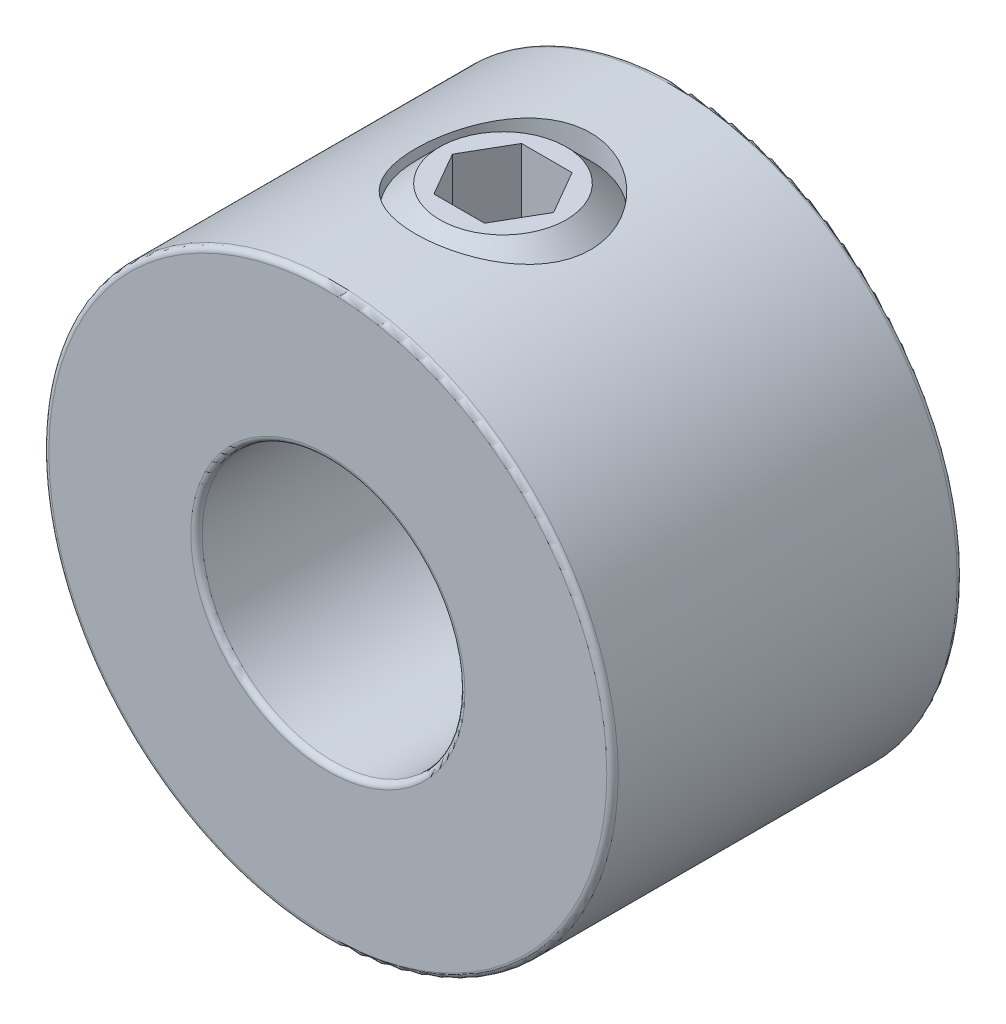
ISO-10303-21;
HEADER;
FILE_DESCRIPTION(('STEP AP214'),'2;1');
FILE_NAME('part.step','',(''),(''),'','','');
FILE_SCHEMA(('AUTOMOTIVE_DESIGN { 1 0 10303 214 1 1 1 1 }'));
ENDSEC;
DATA;
#1=APPLICATION_CONTEXT('core data for automotive mechanical design processes');
#2=APPLICATION_PROTOCOL_DEFINITION('international standard','automotive_design',2000,#1);
#3=PRODUCT_CONTEXT('',#1,'mechanical');
#4=PRODUCT('Part','Part','',(#3));
#5=PRODUCT_RELATED_PRODUCT_CATEGORY('part','',(#4));
#6=PRODUCT_DEFINITION_FORMATION('','',#4);
#7=PRODUCT_DEFINITION_CONTEXT('part definition',#1,'design');
#8=PRODUCT_DEFINITION('design','',#6,#7);
#9=PRODUCT_DEFINITION_SHAPE('','',#8);
#10=(LENGTH_UNIT() NAMED_UNIT(*) SI_UNIT(.MILLI.,.METRE.));
#11=(NAMED_UNIT(*) PLANE_ANGLE_UNIT() SI_UNIT($,.RADIAN.));
#12=(NAMED_UNIT(*) SI_UNIT($,.STERADIAN.) SOLID_ANGLE_UNIT());
#13=UNCERTAINTY_MEASURE_WITH_UNIT(LENGTH_MEASURE(1.E-05),#10,'distance_accuracy_value','');
#14=(GEOMETRIC_REPRESENTATION_CONTEXT(3) GLOBAL_UNCERTAINTY_ASSIGNED_CONTEXT((#13)) GLOBAL_UNIT_ASSIGNED_CONTEXT((#10,
#11,#12)) REPRESENTATION_CONTEXT('',''));
#15=CARTESIAN_POINT('',(0.,0.,0.));
#16=DIRECTION('',(0.,0.,1.));
#17=DIRECTION('',(1.,0.,0.));
#18=AXIS2_PLACEMENT_3D('',#15,#16,#17);
#19=CARTESIAN_POINT('',(0.,3.05662432702594,4.));
#20=DIRECTION('',(0.,1.,0.));
#21=DIRECTION('',(-1.,0.,0.));
#22=AXIS2_PLACEMENT_3D('',#19,#20,#21);
#23=CONICAL_SURFACE('',#22,2.,0.785398163397447);
#24=CARTESIAN_POINT('',(0.,2.5,4.));
#25=DIRECTION('',(0.,-1.,0.));
#26=DIRECTION('',(1.,0.,0.));
#27=AXIS2_PLACEMENT_3D('',#24,#25,#26);
#28=CIRCLE('',#27,1.44337567297405);
#29=CARTESIAN_POINT('',(1.44337567297405,2.5,4.));
#30=VERTEX_POINT('',#29);
#31=EDGE_CURVE('E12',#30,#30,#28,.T.);
#32=ORIENTED_EDGE('',*,*,#31,.F.);
#33=EDGE_LOOP('',(#32));
#34=FACE_BOUND('',#33,.T.);
#35=CARTESIAN_POINT('',(0.,3.05662432702594,4.));
#36=DIRECTION('',(0.,-1.,0.));
#37=DIRECTION('',(1.,0.,0.));
#38=AXIS2_PLACEMENT_3D('',#35,#36,#37);
#39=CIRCLE('',#38,2.);
#40=CARTESIAN_POINT('',(2.,3.05662432702594,4.));
#41=VERTEX_POINT('',#40);
#42=EDGE_CURVE('E140',#41,#41,#39,.T.);
#43=ORIENTED_EDGE('',*,*,#42,.T.);
#44=EDGE_LOOP('',(#43));
#45=FACE_BOUND('',#44,.T.);
#46=ADVANCED_FACE('F41',(#34,#45),#23,.T.);
#47=CARTESIAN_POINT('',(-0.5,2.5,4.));
#48=DIRECTION('',(0.,1.,0.));
#49=DIRECTION('',(-1.,0.,0.));
#50=AXIS2_PLACEMENT_3D('',#47,#48,#49);
#51=PLANE('',#50);
#52=CARTESIAN_POINT('',(0.,2.5,4.));
#53=DIRECTION('',(0.,-1.,0.));
#54=DIRECTION('',(1.,0.,0.));
#55=AXIS2_PLACEMENT_3D('',#52,#53,#54);
#56=CIRCLE('',#55,0.5);
#57=CARTESIAN_POINT('',(0.499999999999999,2.5,4.));
#58=VERTEX_POINT('',#57);
#59=EDGE_CURVE('E48',#58,#58,#56,.T.);
#60=ORIENTED_EDGE('',*,*,#59,.F.);
#61=EDGE_LOOP('',(#60));
#62=FACE_BOUND('',#61,.T.);
#63=ORIENTED_EDGE('',*,*,#31,.T.);
#64=EDGE_LOOP('',(#63));
#65=FACE_BOUND('',#64,.T.);
#66=ADVANCED_FACE('F160',(#62,#65),#51,.F.);
#67=CARTESIAN_POINT('',(0.,2.5,4.));
#68=DIRECTION('',(0.,-1.,0.));
#69=DIRECTION('',(1.,0.,0.));
#70=AXIS2_PLACEMENT_3D('',#67,#68,#69);
#71=CONICAL_SURFACE('',#70,0.5,0.523598775598296);
#72=CARTESIAN_POINT('',(0.,3.36602540378444,4.));
#73=VERTEX_POINT('',#72);
#74=VERTEX_LOOP('',#73);
#75=FACE_BOUND('',#74,.T.);
#76=ORIENTED_EDGE('',*,*,#59,.T.);
#77=EDGE_LOOP('',(#76));
#78=FACE_BOUND('',#77,.T.);
#79=ADVANCED_FACE('F158',(#75,#78),#71,.F.);
#80=CARTESIAN_POINT('',(0.,6.5,4.));
#81=DIRECTION('',(0.,-1.,0.));
#82=DIRECTION('',(1.,0.,0.));
#83=AXIS2_PLACEMENT_3D('',#80,#81,#82);
#84=PLANE('',#83);
#85=DIRECTION('',(0.5,0.,0.866025403784439));
#86=VECTOR('',#85,1.);
#87=CARTESIAN_POINT('',(-1.15470053837923,6.5,4.));
#88=LINE('',#87,#86);
#89=CARTESIAN_POINT('',(-1.15470053837923,6.5,4.));
#90=VERTEX_POINT('',#89);
#91=CARTESIAN_POINT('',(-0.577350269189609,6.5,5.));
#92=VERTEX_POINT('',#91);
#93=EDGE_CURVE('E128',#90,#92,#88,.T.);
#94=ORIENTED_EDGE('',*,*,#93,.F.);
#95=DIRECTION('',(-0.499999999999999,0.,0.866025403784439));
#96=VECTOR('',#95,1.);
#97=CARTESIAN_POINT('',(-0.57735026918961,6.5,3.));
#98=LINE('',#97,#96);
#99=CARTESIAN_POINT('',(-0.57735026918961,6.5,3.));
#100=VERTEX_POINT('',#99);
#101=EDGE_CURVE('E55',#100,#90,#98,.T.);
#102=ORIENTED_EDGE('',*,*,#101,.F.);
#103=DIRECTION('',(-1.,0.,0.));
#104=VECTOR('',#103,1.);
#105=CARTESIAN_POINT('',(0.577350269189642,6.5,3.));
#106=LINE('',#105,#104);
#107=CARTESIAN_POINT('',(0.577350269189642,6.5,3.));
#108=VERTEX_POINT('',#107);
#109=EDGE_CURVE('E114',#108,#100,#106,.T.);
#110=ORIENTED_EDGE('',*,*,#109,.F.);
#111=DIRECTION('',(-0.5,0.,-0.866025403784438));
#112=VECTOR('',#111,1.);
#113=CARTESIAN_POINT('',(1.15470053837927,6.5,4.));
#114=LINE('',#113,#112);
#115=CARTESIAN_POINT('',(1.15470053837927,6.5,4.));
#116=VERTEX_POINT('',#115);
#117=EDGE_CURVE('E117',#116,#108,#114,.T.);
#118=ORIENTED_EDGE('',*,*,#117,.F.);
#119=DIRECTION('',(0.499999999999999,0.,-0.866025403784439));
#120=VECTOR('',#119,1.);
#121=CARTESIAN_POINT('',(0.577350269189644,6.5,5.));
#122=LINE('',#121,#120);
#123=CARTESIAN_POINT('',(0.577350269189644,6.5,5.));
#124=VERTEX_POINT('',#123);
#125=EDGE_CURVE('E133',#124,#116,#122,.T.);
#126=ORIENTED_EDGE('',*,*,#125,.F.);
#127=DIRECTION('',(1.,0.,0.));
#128=VECTOR('',#127,1.);
#129=CARTESIAN_POINT('',(-0.577350269189609,6.5,5.));
#130=LINE('',#129,#128);
#131=EDGE_CURVE('E130',#92,#124,#130,.T.);
#132=ORIENTED_EDGE('',*,*,#131,.F.);
#133=EDGE_LOOP('',(#94,#102,#110,#118,#126,#132));
#134=FACE_BOUND('',#133,.T.);
#135=CARTESIAN_POINT('',(0.,6.5,4.));
#136=DIRECTION('',(0.,-1.,0.));
#137=DIRECTION('',(1.,0.,0.));
#138=AXIS2_PLACEMENT_3D('',#135,#136,#137);
#139=CIRCLE('',#138,1.44337567297406);
#140=CARTESIAN_POINT('',(1.44337567297406,6.5,4.));
#141=VERTEX_POINT('',#140);
#142=EDGE_CURVE('E153',#141,#141,#139,.T.);
#143=ORIENTED_EDGE('',*,*,#142,.F.);
#144=EDGE_LOOP('',(#143));
#145=FACE_BOUND('',#144,.T.);
#146=ADVANCED_FACE('F178',(#134,#145),#84,.F.);
#147=CARTESIAN_POINT('',(0.,6.5,4.));
#148=DIRECTION('',(0.,-1.,0.));
#149=DIRECTION('',(1.,0.,0.));
#150=AXIS2_PLACEMENT_3D('',#147,#148,#149);
#151=CONICAL_SURFACE('',#150,1.44337567297406,0.785398163397446);
#152=CARTESIAN_POINT('',(0.,5.94337567297405,4.));
#153=DIRECTION('',(0.,-1.,0.));
#154=DIRECTION('',(1.,0.,0.));
#155=AXIS2_PLACEMENT_3D('',#152,#153,#154);
#156=CIRCLE('',#155,2.);
#157=CARTESIAN_POINT('',(2.,5.94337567297405,4.));
#158=VERTEX_POINT('',#157);
#159=EDGE_CURVE('E150',#158,#158,#156,.T.);
#160=ORIENTED_EDGE('',*,*,#159,.F.);
#161=EDGE_LOOP('',(#160));
#162=FACE_BOUND('',#161,.T.);
#163=ORIENTED_EDGE('',*,*,#142,.T.);
#164=EDGE_LOOP('',(#163));
#165=FACE_BOUND('',#164,.T.);
#166=ADVANCED_FACE('F172',(#162,#165),#151,.T.);
#167=CARTESIAN_POINT('',(0.,3.36602540378444,4.));
#168=DIRECTION('',(0.,-1.,0.));
#169=DIRECTION('',(1.,0.,0.));
#170=AXIS2_PLACEMENT_3D('',#167,#168,#169);
#171=CYLINDRICAL_SURFACE('',#170,2.);
#172=ORIENTED_EDGE('',*,*,#42,.F.);
#173=EDGE_LOOP('',(#172));
#174=FACE_BOUND('',#173,.T.);
#175=ORIENTED_EDGE('',*,*,#159,.T.);
#176=EDGE_LOOP('',(#175));
#177=FACE_BOUND('',#176,.T.);
#178=ADVANCED_FACE('F169',(#174,#177),#171,.T.);
#179=CARTESIAN_POINT('',(-0.577350269189609,4.9,3.));
#180=DIRECTION('',(-0.866025403784439,0.,-0.5));
#181=DIRECTION('',(-0.5,0.,0.866025403784439));
#182=AXIS2_PLACEMENT_3D('',#179,#180,#181);
#183=PLANE('',#182);
#184=ORIENTED_EDGE('',*,*,#101,.T.);
#185=DIRECTION('',(0.,1.,0.));
#186=VECTOR('',#185,1.);
#187=CARTESIAN_POINT('',(-1.15470053837923,4.9,4.));
#188=LINE('',#187,#186);
#189=CARTESIAN_POINT('',(-1.15470053837923,4.9,4.));
#190=VERTEX_POINT('',#189);
#191=EDGE_CURVE('E91',#190,#90,#188,.T.);
#192=ORIENTED_EDGE('',*,*,#191,.F.);
#193=DIRECTION('',(-0.499999999999999,0.,0.866025403784439));
#194=VECTOR('',#193,1.);
#195=CARTESIAN_POINT('',(-0.577350269189609,4.9,3.));
#196=LINE('',#195,#194);
#197=CARTESIAN_POINT('',(-0.577350269189609,4.9,3.));
#198=VERTEX_POINT('',#197);
#199=EDGE_CURVE('E95',#198,#190,#196,.T.);
#200=ORIENTED_EDGE('',*,*,#199,.F.);
#201=DIRECTION('',(0.,1.,0.));
#202=VECTOR('',#201,1.);
#203=CARTESIAN_POINT('',(-0.577350269189609,4.9,3.));
#204=LINE('',#203,#202);
#205=EDGE_CURVE('E138',#198,#100,#204,.T.);
#206=ORIENTED_EDGE('',*,*,#205,.T.);
#207=EDGE_LOOP('',(#184,#192,#200,#206));
#208=FACE_BOUND('',#207,.T.);
#209=ADVANCED_FACE('F93',(#208),#183,.F.);
#210=CARTESIAN_POINT('',(0.577350269189643,4.9,3.));
#211=DIRECTION('',(0.,0.,-1.));
#212=DIRECTION('',(-1.,0.,0.));
#213=AXIS2_PLACEMENT_3D('',#210,#211,#212);
#214=PLANE('',#213);
#215=ORIENTED_EDGE('',*,*,#109,.T.);
#216=ORIENTED_EDGE('',*,*,#205,.F.);
#217=DIRECTION('',(-1.,0.,0.));
#218=VECTOR('',#217,1.);
#219=CARTESIAN_POINT('',(0.577350269189643,4.9,3.));
#220=LINE('',#219,#218);
#221=CARTESIAN_POINT('',(0.577350269189643,4.9,3.));
#222=VERTEX_POINT('',#221);
#223=EDGE_CURVE('E101',#222,#198,#220,.T.);
#224=ORIENTED_EDGE('',*,*,#223,.F.);
#225=DIRECTION('',(0.,1.,0.));
#226=VECTOR('',#225,1.);
#227=CARTESIAN_POINT('',(0.577350269189643,4.9,3.));
#228=LINE('',#227,#226);
#229=EDGE_CURVE('E141',#222,#108,#228,.T.);
#230=ORIENTED_EDGE('',*,*,#229,.T.);
#231=EDGE_LOOP('',(#215,#216,#224,#230));
#232=FACE_BOUND('',#231,.T.);
#233=ADVANCED_FACE('F192',(#232),#214,.F.);
#234=CARTESIAN_POINT('',(1.15470053837927,4.9,4.));
#235=DIRECTION('',(0.866025403784438,0.,-0.5));
#236=DIRECTION('',(-0.5,0.,-0.866025403784438));
#237=AXIS2_PLACEMENT_3D('',#234,#235,#236);
#238=PLANE('',#237);
#239=ORIENTED_EDGE('',*,*,#117,.T.);
#240=ORIENTED_EDGE('',*,*,#229,.F.);
#241=DIRECTION('',(-0.5,0.,-0.866025403784438));
#242=VECTOR('',#241,1.);
#243=CARTESIAN_POINT('',(1.15470053837927,4.9,4.));
#244=LINE('',#243,#242);
#245=CARTESIAN_POINT('',(1.15470053837927,4.9,4.));
#246=VERTEX_POINT('',#245);
#247=EDGE_CURVE('E124',#246,#222,#244,.T.);
#248=ORIENTED_EDGE('',*,*,#247,.F.);
#249=DIRECTION('',(0.,1.,0.));
#250=VECTOR('',#249,1.);
#251=CARTESIAN_POINT('',(1.15470053837927,4.9,4.));
#252=LINE('',#251,#250);
#253=EDGE_CURVE('E143',#246,#116,#252,.T.);
#254=ORIENTED_EDGE('',*,*,#253,.T.);
#255=EDGE_LOOP('',(#239,#240,#248,#254));
#256=FACE_BOUND('',#255,.T.);
#257=ADVANCED_FACE('F202',(#256),#238,.F.);
#258=CARTESIAN_POINT('',(0.577350269189644,4.9,5.));
#259=DIRECTION('',(0.866025403784439,0.,0.499999999999999));
#260=DIRECTION('',(0.499999999999999,0.,-0.866025403784439));
#261=AXIS2_PLACEMENT_3D('',#258,#259,#260);
#262=PLANE('',#261);
#263=ORIENTED_EDGE('',*,*,#125,.T.);
#264=ORIENTED_EDGE('',*,*,#253,.F.);
#265=DIRECTION('',(0.499999999999999,0.,-0.866025403784439));
#266=VECTOR('',#265,1.);
#267=CARTESIAN_POINT('',(0.577350269189644,4.9,5.));
#268=LINE('',#267,#266);
#269=CARTESIAN_POINT('',(0.577350269189644,4.9,5.));
#270=VERTEX_POINT('',#269);
#271=EDGE_CURVE('E121',#270,#246,#268,.T.);
#272=ORIENTED_EDGE('',*,*,#271,.F.);
#273=DIRECTION('',(0.,1.,0.));
#274=VECTOR('',#273,1.);
#275=CARTESIAN_POINT('',(0.577350269189644,4.9,5.));
#276=LINE('',#275,#274);
#277=EDGE_CURVE('E145',#270,#124,#276,.T.);
#278=ORIENTED_EDGE('',*,*,#277,.T.);
#279=EDGE_LOOP('',(#263,#264,#272,#278));
#280=FACE_BOUND('',#279,.T.);
#281=ADVANCED_FACE('F198',(#280),#262,.F.);
#282=CARTESIAN_POINT('',(-0.577350269189609,4.9,5.));
#283=DIRECTION('',(0.,0.,1.));
#284=DIRECTION('',(1.,0.,0.));
#285=AXIS2_PLACEMENT_3D('',#282,#283,#284);
#286=PLANE('',#285);
#287=ORIENTED_EDGE('',*,*,#131,.T.);
#288=ORIENTED_EDGE('',*,*,#277,.F.);
#289=DIRECTION('',(1.,0.,0.));
#290=VECTOR('',#289,1.);
#291=CARTESIAN_POINT('',(-0.577350269189609,4.9,5.));
#292=LINE('',#291,#290);
#293=CARTESIAN_POINT('',(-0.577350269189609,4.9,5.));
#294=VERTEX_POINT('',#293);
#295=EDGE_CURVE('E109',#294,#270,#292,.T.);
#296=ORIENTED_EDGE('',*,*,#295,.F.);
#297=DIRECTION('',(0.,1.,0.));
#298=VECTOR('',#297,1.);
#299=CARTESIAN_POINT('',(-0.577350269189609,4.9,5.));
#300=LINE('',#299,#298);
#301=EDGE_CURVE('E100',#294,#92,#300,.T.);
#302=ORIENTED_EDGE('',*,*,#301,.T.);
#303=EDGE_LOOP('',(#287,#288,#296,#302));
#304=FACE_BOUND('',#303,.T.);
#305=ADVANCED_FACE('F195',(#304),#286,.F.);
#306=CARTESIAN_POINT('',(-1.15470053837923,4.9,4.));
#307=DIRECTION('',(-0.866025403784439,0.,0.5));
#308=DIRECTION('',(0.5,0.,0.866025403784439));
#309=AXIS2_PLACEMENT_3D('',#306,#307,#308);
#310=PLANE('',#309);
#311=ORIENTED_EDGE('',*,*,#93,.T.);
#312=ORIENTED_EDGE('',*,*,#301,.F.);
#313=DIRECTION('',(0.5,0.,0.866025403784439));
#314=VECTOR('',#313,1.);
#315=CARTESIAN_POINT('',(-1.15470053837923,4.9,4.));
#316=LINE('',#315,#314);
#317=EDGE_CURVE('E104',#190,#294,#316,.T.);
#318=ORIENTED_EDGE('',*,*,#317,.F.);
#319=ORIENTED_EDGE('',*,*,#191,.T.);
#320=EDGE_LOOP('',(#311,#312,#318,#319));
#321=FACE_BOUND('',#320,.T.);
#322=ADVANCED_FACE('F105',(#321),#310,.F.);
#323=CARTESIAN_POINT('',(-0.577350269189609,4.9,3.));
#324=DIRECTION('',(0.,-1.,0.));
#325=DIRECTION('',(0.,0.,-1.));
#326=AXIS2_PLACEMENT_3D('',#323,#324,#325);
#327=PLANE('',#326);
#328=ORIENTED_EDGE('',*,*,#199,.T.);
#329=ORIENTED_EDGE('',*,*,#317,.T.);
#330=ORIENTED_EDGE('',*,*,#295,.T.);
#331=ORIENTED_EDGE('',*,*,#271,.T.);
#332=ORIENTED_EDGE('',*,*,#247,.T.);
#333=ORIENTED_EDGE('',*,*,#223,.T.);
#334=EDGE_LOOP('',(#328,#329,#330,#331,#332,#333));
#335=FACE_BOUND('',#334,.T.);
#336=ADVANCED_FACE('F111',(#335),#327,.F.);
#337=CLOSED_SHELL('',(#46,#66,#79,#146,#166,#178,#209,#233,#257,#281,#305,#322,#336));
#338=MANIFOLD_SOLID_BREP('B2',#337);
#339=CARTESIAN_POINT('',(0.,0.,8.));
#340=DIRECTION('',(0.,0.,1.));
#341=DIRECTION('',(1.,0.,0.));
#342=AXIS2_PLACEMENT_3D('',#339,#340,#341);
#343=PLANE('',#342);
#344=CARTESIAN_POINT('',(0.,0.,8.));
#345=DIRECTION('',(0.,0.,1.));
#346=DIRECTION('',(1.,0.,0.));
#347=AXIS2_PLACEMENT_3D('',#344,#345,#346);
#348=CIRCLE('',#347,3.13);
#349=CARTESIAN_POINT('',(3.13,0.,8.));
#350=VERTEX_POINT('',#349);
#351=EDGE_CURVE('E307',#350,#350,#348,.F.);
#352=ORIENTED_EDGE('',*,*,#351,.T.);
#353=EDGE_LOOP('',(#352));
#354=FACE_BOUND('',#353,.T.);
#355=CARTESIAN_POINT('',(0.,0.,8.));
#356=DIRECTION('',(0.,0.,1.));
#357=DIRECTION('',(1.,0.,0.));
#358=AXIS2_PLACEMENT_3D('',#355,#356,#357);
#359=CIRCLE('',#358,6.37);
#360=CARTESIAN_POINT('',(6.37,0.,8.));
#361=VERTEX_POINT('',#360);
#362=EDGE_CURVE('E311',#361,#361,#359,.T.);
#363=ORIENTED_EDGE('',*,*,#362,.T.);
#364=EDGE_LOOP('',(#363));
#365=FACE_BOUND('',#364,.T.);
#366=ADVANCED_FACE('F296',(#354,#365),#343,.T.);
#367=CARTESIAN_POINT('',(0.,0.,0.));
#368=DIRECTION('',(0.,0.,1.));
#369=DIRECTION('',(1.,0.,0.));
#370=AXIS2_PLACEMENT_3D('',#367,#368,#369);
#371=PLANE('',#370);
#372=CARTESIAN_POINT('',(0.,0.,0.));
#373=DIRECTION('',(0.,0.,1.));
#374=DIRECTION('',(1.,0.,0.));
#375=AXIS2_PLACEMENT_3D('',#372,#373,#374);
#376=CIRCLE('',#375,3.13);
#377=CARTESIAN_POINT('',(3.13,0.,0.));
#378=VERTEX_POINT('',#377);
#379=EDGE_CURVE('E322',#378,#378,#376,.T.);
#380=ORIENTED_EDGE('',*,*,#379,.T.);
#381=EDGE_LOOP('',(#380));
#382=FACE_BOUND('',#381,.T.);
#383=CARTESIAN_POINT('',(0.,0.,0.));
#384=DIRECTION('',(0.,0.,1.));
#385=DIRECTION('',(1.,0.,0.));
#386=AXIS2_PLACEMENT_3D('',#383,#384,#385);
#387=CIRCLE('',#386,6.37);
#388=CARTESIAN_POINT('',(6.37,0.,0.));
#389=VERTEX_POINT('',#388);
#390=EDGE_CURVE('E325',#389,#389,#387,.F.);
#391=ORIENTED_EDGE('',*,*,#390,.T.);
#392=EDGE_LOOP('',(#391));
#393=FACE_BOUND('',#392,.T.);
#394=ADVANCED_FACE('F359',(#382,#393),#371,.F.);
#395=CARTESIAN_POINT('',(0.,0.,8.));
#396=DIRECTION('',(0.,0.,-1.));
#397=DIRECTION('',(-1.,0.,0.));
#398=AXIS2_PLACEMENT_3D('',#395,#396,#397);
#399=CYLINDRICAL_SURFACE('',#398,6.5);
#400=CARTESIAN_POINT('',(0.,0.,0.13));
#401=DIRECTION('',(0.,0.,1.));
#402=DIRECTION('',(1.,0.,0.));
#403=AXIS2_PLACEMENT_3D('',#400,#401,#402);
#404=CIRCLE('',#403,6.5);
#405=CARTESIAN_POINT('',(6.5,0.,0.13));
#406=VERTEX_POINT('',#405);
#407=EDGE_CURVE('E40',#406,#406,#404,.T.);
#408=ORIENTED_EDGE('',*,*,#407,.T.);
#409=EDGE_LOOP('',(#408));
#410=FACE_BOUND('',#409,.T.);
#411=CARTESIAN_POINT('',(0.,0.,7.87));
#412=DIRECTION('',(0.,0.,1.));
#413=DIRECTION('',(1.,0.,0.));
#414=AXIS2_PLACEMENT_3D('',#411,#412,#413);
#415=CIRCLE('',#414,6.5);
#416=CARTESIAN_POINT('',(6.5,0.,7.87));
#417=VERTEX_POINT('',#416);
#418=EDGE_CURVE('E303',#417,#417,#415,.F.);
#419=ORIENTED_EDGE('',*,*,#418,.T.);
#420=EDGE_LOOP('',(#419));
#421=FACE_BOUND('',#420,.T.);
#422=CARTESIAN_POINT('',(0.,6.5,6.));
#423=CARTESIAN_POINT('',(-0.10958647155408,6.49999929187436,5.99999903907904));
#424=CARTESIAN_POINT('',(-0.219182761349475,6.49720235792931,5.99096335239673));
#425=CARTESIAN_POINT('',(-0.435175528984373,6.48631855265072,5.95515058806477));
#426=CARTESIAN_POINT('',(-0.541571186300281,6.47823033671536,5.92836900086749));
#427=CARTESIAN_POINT('',(-0.748016546984701,6.45764858487676,5.85804929310721));
#428=CARTESIAN_POINT('',(-0.848075627090343,6.44516174661238,5.81453663922322));
#429=CARTESIAN_POINT('',(-1.03947745536717,6.41707535917941,5.71209679263276));
#430=CARTESIAN_POINT('',(-1.13081890919355,6.40147534884382,5.65316731576617));
#431=CARTESIAN_POINT('',(-1.30493699247679,6.36829752406617,5.51970232456005));
#432=CARTESIAN_POINT('',(-1.38741488565838,6.35067760587489,5.44478758075688));
#433=CARTESIAN_POINT('',(-1.53885708269872,6.31569252815343,5.28228637649204));
#434=CARTESIAN_POINT('',(-1.60781896662595,6.29832741475793,5.19469765172807));
#435=CARTESIAN_POINT('',(-1.73187276184925,6.2653687784566,5.00677139557264));
#436=CARTESIAN_POINT('',(-1.78659481361997,6.24982736044083,4.90617971070223));
#437=CARTESIAN_POINT('',(-1.8782224418158,6.22290748386974,4.69666603626275));
#438=CARTESIAN_POINT('',(-1.91513254914664,6.21152796681115,4.58774617334561));
#439=CARTESIAN_POINT('',(-1.96900160513188,6.19466009001292,4.36803269394755));
#440=CARTESIAN_POINT('',(-1.9865133955599,6.18900890037713,4.25738746639271));
#441=CARTESIAN_POINT('',(-2.00281555895419,6.1837537050085,4.03459625942759));
#442=CARTESIAN_POINT('',(-2.00161073572821,6.18414814760279,3.9224506724825));
#443=CARTESIAN_POINT('',(-1.98094698228321,6.19079569362891,3.7043849294011));
#444=CARTESIAN_POINT('',(-1.96218684702854,6.19682450731138,3.59839057467777));
#445=CARTESIAN_POINT('',(-1.90807645250928,6.21369772255051,3.39113330340309));
#446=CARTESIAN_POINT('',(-1.87272447914839,6.22454262164885,3.28987087689416));
#447=CARTESIAN_POINT('',(-1.785932217008,6.25000070721951,3.09326995215499));
#448=CARTESIAN_POINT('',(-1.73426970827151,6.2646654217354,2.99803651437156));
#449=CARTESIAN_POINT('',(-1.61647725848254,6.29608673576222,2.81735945562831));
#450=CARTESIAN_POINT('',(-1.55034365635742,6.31284386417593,2.73191832039407));
#451=CARTESIAN_POINT('',(-1.40204114131455,6.34746551983527,2.56929561166794));
#452=CARTESIAN_POINT('',(-1.31929416295853,6.36534631113152,2.49264371743337));
#453=CARTESIAN_POINT('',(-1.14189770882472,6.39954830533242,2.35417779565687));
#454=CARTESIAN_POINT('',(-1.04724740490765,6.4158693995865,2.2923648013595));
#455=CARTESIAN_POINT('',(-0.847732923697557,6.44527556867774,2.1849870228725));
#456=CARTESIAN_POINT('',(-0.742798718966907,6.45833594999018,2.13954513596117));
#457=CARTESIAN_POINT('',(-0.526280934909781,6.47957102319473,2.06711374604147));
#458=CARTESIAN_POINT('',(-0.414699321015766,6.48774715140185,2.04011881798934));
#459=CARTESIAN_POINT('',(-0.192552832432243,6.49806290071844,2.00624195342491));
#460=CARTESIAN_POINT('',(-0.0821071867281234,6.50041772114305,1.9986426474343));
#461=CARTESIAN_POINT('',(0.138491178007733,6.49946000316609,2.00175476648801));
#462=CARTESIAN_POINT('',(0.248643936188298,6.49614826472318,2.01246360693707));
#463=CARTESIAN_POINT('',(0.46278580145148,6.48437074848215,2.05131048211023));
#464=CARTESIAN_POINT('',(0.566859358780056,6.47603039774079,2.07902464716616));
#465=CARTESIAN_POINT('',(0.768852811369362,6.45516726536364,2.1505810764271));
#466=CARTESIAN_POINT('',(0.866771952253669,6.44264397218779,2.19442531327609));
#467=CARTESIAN_POINT('',(1.05627961444668,6.41433382910965,2.29817119480995));
#468=CARTESIAN_POINT('',(1.14766081519562,6.39847611273322,2.35843167676517));
#469=CARTESIAN_POINT('',(1.31925606832413,6.36531333623025,2.49286683008083));
#470=CARTESIAN_POINT('',(1.39946717074091,6.34800789569184,2.56704516497603));
#471=CARTESIAN_POINT('',(1.54963528009096,6.31306645909658,2.73058329944897));
#472=CARTESIAN_POINT('',(1.61908131008095,6.29544322340724,2.82041607594928));
#473=CARTESIAN_POINT('',(1.74195487773042,6.26255963317191,3.01084333460187));
#474=CARTESIAN_POINT('',(1.79538273895787,6.24729923089955,3.11143759931574));
#475=CARTESIAN_POINT('',(1.88435707765313,6.22104126828922,3.32027825692904));
#476=CARTESIAN_POINT('',(1.9199786710239,6.21002584634022,3.42849026977304));
#477=CARTESIAN_POINT('',(1.97237526121825,6.19358575896332,3.64978261572606));
#478=CARTESIAN_POINT('',(1.98915714872108,6.18815904950702,3.76286115316602));
#479=CARTESIAN_POINT('',(2.00291323790433,6.18371932373484,3.98534807210793));
#480=CARTESIAN_POINT('',(2.00072360720728,6.18443554393433,4.09470000455106));
#481=CARTESIAN_POINT('',(1.97860856561739,6.19154584982148,4.31139783884726));
#482=CARTESIAN_POINT('',(1.95868393542585,6.19793968557834,4.41874382879029));
#483=CARTESIAN_POINT('',(1.90221657867545,6.21549850608435,4.6269374285375));
#484=CARTESIAN_POINT('',(1.8659061649831,6.22659666514378,4.72785410568484));
#485=CARTESIAN_POINT('',(1.77788001247773,6.25229841004041,4.92224355662551));
#486=CARTESIAN_POINT('',(1.72616121006624,6.26690269287625,5.01571484538877));
#487=CARTESIAN_POINT('',(1.60648172875981,6.29866516433667,5.19641250748051));
#488=CARTESIAN_POINT('',(1.5379775201733,6.31589943241281,5.28326549413257));
#489=CARTESIAN_POINT('',(1.38763671757875,6.35062263668655,5.44451406697948));
#490=CARTESIAN_POINT('',(1.30579660000223,6.36811163907406,5.51890635028653));
#491=CARTESIAN_POINT('',(1.12802317077525,6.40203042414331,5.65544917959683));
#492=CARTESIAN_POINT('',(1.0317288656853,6.41840990638034,5.71714357533484));
#493=CARTESIAN_POINT('',(0.829631192009798,6.44764383058531,5.82338445665249));
#494=CARTESIAN_POINT('',(0.723831864032401,6.46049976109691,5.86793818662102));
#495=CARTESIAN_POINT('',(0.515929652571418,6.48025348346413,5.93510071206019));
#496=CARTESIAN_POINT('',(0.414403258515526,6.48759534805451,5.95936947108914));
#497=CARTESIAN_POINT('',(0.208587191828518,6.4974684909107,5.99181805932323));
#498=CARTESIAN_POINT('',(0.104298042658335,6.50000067395288,6.00000091454879));
#499=CARTESIAN_POINT('',(0.,6.5,6.));
#500=B_SPLINE_CURVE_WITH_KNOTS('',3,(#422,#423,#424,#425,#426,#427,#428,#429,#430,#431,#432,
#433,#434,#435,#436,#437,#438,#439,#440,#441,#442,#443,#444,#445,#446,#447,#448,#449,#450,#451,
#452,#453,#454,#455,#456,#457,#458,#459,#460,#461,#462,#463,#464,#465,#466,#467,#468,#469,#470,
#471,#472,#473,#474,#475,#476,#477,#478,#479,#480,#481,#482,#483,#484,#485,#486,#487,#488,#489,
#490,#491,#492,#493,#494,#495,#496,#497,#498,#499),.UNSPECIFIED.,.T.,.F.,(4,2,2,2,2,2,2,2,2,2,2,
2,2,2,2,2,2,2,2,2,2,2,2,2,2,2,2,2,2,2,2,2,2,2,2,2,2,2,4),(0.,0.328376148353204,
0.656835774920463,0.984797413319643,1.31280767013794,1.64969601962051,1.98664463123191,
2.33162619975385,2.67651996741947,3.0113091274622,3.34601236190892,3.66793485951994,
3.98989062214147,4.31643724588171,4.64306657905952,4.98408507994297,5.32512731933627,
5.66867887562647,6.01212935372403,6.34267966649236,6.67318331870836,6.99576592200041,
7.31838798898982,7.6487232534981,7.97914559299321,8.322234878021,8.6653172321574,
9.00693981167224,9.34843740094787,9.67496275718919,10.0014737403731,10.3234943027839,
10.6455789342452,10.9799294848454,11.3143685200785,11.6592775258489,12.0040405975475,
12.3166287634493,12.6291581207982),.UNSPECIFIED.);
#501=CARTESIAN_POINT('',(0.,6.5,6.));
#502=VERTEX_POINT('',#501);
#503=EDGE_CURVE('E328',#502,#502,#500,.T.);
#504=ORIENTED_EDGE('',*,*,#503,.T.);
#505=EDGE_LOOP('',(#504));
#506=FACE_BOUND('',#505,.T.);
#507=ADVANCED_FACE('F355',(#410,#421,#506),#399,.T.);
#508=CARTESIAN_POINT('',(0.,0.,8.));
#509=DIRECTION('',(0.,0.,-1.));
#510=DIRECTION('',(-1.,0.,0.));
#511=AXIS2_PLACEMENT_3D('',#508,#509,#510);
#512=CYLINDRICAL_SURFACE('',#511,3.);
#513=CARTESIAN_POINT('',(0.,0.,0.13));
#514=DIRECTION('',(0.,0.,1.));
#515=DIRECTION('',(1.,0.,0.));
#516=AXIS2_PLACEMENT_3D('',#513,#514,#515);
#517=CIRCLE('',#516,3.);
#518=CARTESIAN_POINT('',(3.,0.,0.13));
#519=VERTEX_POINT('',#518);
#520=EDGE_CURVE('E316',#519,#519,#517,.F.);
#521=ORIENTED_EDGE('',*,*,#520,.T.);
#522=EDGE_LOOP('',(#521));
#523=FACE_BOUND('',#522,.T.);
#524=CARTESIAN_POINT('',(0.,0.,7.87));
#525=DIRECTION('',(0.,0.,1.));
#526=DIRECTION('',(1.,0.,0.));
#527=AXIS2_PLACEMENT_3D('',#524,#525,#526);
#528=CIRCLE('',#527,3.);
#529=CARTESIAN_POINT('',(3.,0.,7.87));
#530=VERTEX_POINT('',#529);
#531=EDGE_CURVE('E319',#530,#530,#528,.T.);
#532=ORIENTED_EDGE('',*,*,#531,.T.);
#533=EDGE_LOOP('',(#532));
#534=FACE_BOUND('',#533,.T.);
#535=CARTESIAN_POINT('',(0.,3.,6.));
#536=CARTESIAN_POINT('',(-0.100484716668078,3.0000004164484,6.00000054963247));
#537=CARTESIAN_POINT('',(-0.200969087132901,2.99490802753388,5.9923860300445));
#538=CARTESIAN_POINT('',(-0.398733058031681,2.97504652423809,5.96240313589434));
#539=CARTESIAN_POINT('',(-0.496011113955007,2.96027281581235,5.94002775687671));
#540=CARTESIAN_POINT('',(-0.684212307854249,2.92250482404708,5.88189228267516));
#541=CARTESIAN_POINT('',(-0.775162872657554,2.89954905493315,5.84619485999206));
#542=CARTESIAN_POINT('',(-0.94941529099726,2.8472613787744,5.7629366367285));
#543=CARTESIAN_POINT('',(-1.03271603160967,2.8179285460551,5.71537411369944));
#544=CARTESIAN_POINT('',(-1.19728470077011,2.75227329369838,5.60534306263257));
#545=CARTESIAN_POINT('',(-1.27778030546067,2.71556897579319,5.54195213925711));
#546=CARTESIAN_POINT('',(-1.42772804469274,2.63982313083466,5.40426995134155));
#547=CARTESIAN_POINT('',(-1.49716405543888,2.60077830356832,5.32996307016226));
#548=CARTESIAN_POINT('',(-1.63422297745496,2.51728264678794,5.15894763238733));
#549=CARTESIAN_POINT('',(-1.6998318636275,2.47295067937795,5.06055434679655));
#550=CARTESIAN_POINT('',(-1.81350357014175,2.3908414735282,4.85163662235347));
#551=CARTESIAN_POINT('',(-1.86159673426503,2.35305295954668,4.74113359843726));
#552=CARTESIAN_POINT('',(-1.92674035011438,2.29976266641461,4.54328870657837));
#553=CARTESIAN_POINT('',(-1.94874447236008,2.28097627892403,4.45847154712609));
#554=CARTESIAN_POINT('',(-1.98150617785228,2.25257969659604,4.28525549525835));
#555=CARTESIAN_POINT('',(-1.99228314651963,2.24295368744147,4.19686305127394));
#556=CARTESIAN_POINT('',(-2.00191364141227,2.23436605608045,4.01852522114353));
#557=CARTESIAN_POINT('',(-2.00071842917524,2.23544802558502,3.9285749765476));
#558=CARTESIAN_POINT('',(-1.98637581333356,2.24819775483425,3.75036502650025));
#559=CARTESIAN_POINT('',(-1.97321828380393,2.25987448286881,3.66210681797187));
#560=CARTESIAN_POINT('',(-1.93664994217326,2.29127185989959,3.49353294875812));
#561=CARTESIAN_POINT('',(-1.91371711479477,2.31061488324375,3.41303866406123));
#562=CARTESIAN_POINT('',(-1.85870118583424,2.35509622933623,3.25697630902422));
#563=CARTESIAN_POINT('',(-1.8266150732855,2.3802364585489,3.18140986976135));
#564=CARTESIAN_POINT('',(-1.74673818732648,2.43964196377947,3.02097460464356));
#565=CARTESIAN_POINT('',(-1.69708052300445,2.47472317740626,2.93734009951691));
#566=CARTESIAN_POINT('',(-1.58668960438221,2.54691537733438,2.77861660471425));
#567=CARTESIAN_POINT('',(-1.52594268999614,2.58402882709328,2.70353834223793));
#568=CARTESIAN_POINT('',(-1.37981165322309,2.66543343763724,2.54745745439658));
#569=CARTESIAN_POINT('',(-1.29193938283656,2.7095474472056,2.46866595131724));
#570=CARTESIAN_POINT('',(-1.10200799908008,2.79218100665211,2.32680350546152));
#571=CARTESIAN_POINT('',(-0.999962299343699,2.83070577648042,2.26371785459102));
#572=CARTESIAN_POINT('',(-0.804857827096532,2.89145404090364,2.16652228137713));
#573=CARTESIAN_POINT('',(-0.713957643371912,2.9153926116554,2.12915663666106));
#574=CARTESIAN_POINT('',(-0.526036043935482,2.95507719030499,2.06789507437463));
#575=CARTESIAN_POINT('',(-0.429019879001652,2.97083012127543,2.04398777286779));
#576=CARTESIAN_POINT('',(-0.230985453172282,2.99275882156808,2.010838834762));
#577=CARTESIAN_POINT('',(-0.129951811934159,2.99889322461187,2.00166053906174));
#578=CARTESIAN_POINT('',(0.0724415193893452,3.00083114965147,1.99875291143779));
#579=CARTESIAN_POINT('',(0.173801186186624,2.99663539385634,2.00502249951123));
#580=CARTESIAN_POINT('',(0.366455717204237,2.97899589424273,2.03162405556195));
#581=CARTESIAN_POINT('',(0.457957444679191,2.96622246390226,2.05093729775522));
#582=CARTESIAN_POINT('',(0.636116392427399,2.93318449284837,2.10159568601286));
#583=CARTESIAN_POINT('',(0.722772837571132,2.91291875746989,2.13294275092821));
#584=CARTESIAN_POINT('',(0.894664750465995,2.86496352529158,2.20865229704492));
#585=CARTESIAN_POINT('',(0.979496184631417,2.83689870135785,2.25368815408186));
#586=CARTESIAN_POINT('',(1.14068302395729,2.77601855611511,2.35443328994627));
#587=CARTESIAN_POINT('',(1.21703314820091,2.74320030403941,2.41014916053217));
#588=CARTESIAN_POINT('',(1.37185445482324,2.6695454665343,2.54060786815751));
#589=CARTESIAN_POINT('',(1.44875187569565,2.62826156800165,2.61696626007509));
#590=CARTESIAN_POINT('',(1.58933968069449,2.54571173085958,2.78111142995712));
#591=CARTESIAN_POINT('',(1.6530209365723,2.50444582417845,2.86890603910751));
#592=CARTESIAN_POINT('',(1.76124776549313,2.4293967897058,3.04714241276812));
#593=CARTESIAN_POINT('',(1.80695636125283,2.39527597025701,3.13673203346221));
#594=CARTESIAN_POINT('',(1.88496213740264,2.33438974266155,3.32387265244363));
#595=CARTESIAN_POINT('',(1.91728345682189,2.30761112529822,3.42140893830462));
#596=CARTESIAN_POINT('',(1.9623584346534,2.26933208182633,3.60456448719541));
#597=CARTESIAN_POINT('',(1.97758597566225,2.25594998021257,3.68917180987601));
#598=CARTESIAN_POINT('',(1.99699205923373,2.23879466438398,3.86057328131839));
#599=CARTESIAN_POINT('',(2.00118260285317,2.23501101347816,3.9473649511395));
#600=CARTESIAN_POINT('',(1.99823921981266,2.23764201149981,4.1206430567237));
#601=CARTESIAN_POINT('',(1.99109858767783,2.24406269907463,4.20712928137376));
#602=CARTESIAN_POINT('',(1.96596997224746,2.26610452403491,4.37734352853212));
#603=CARTESIAN_POINT('',(1.94796751728258,2.28173793527615,4.46106771382432));
#604=CARTESIAN_POINT('',(1.89593035657494,2.32526843904801,4.64571118648124));
#605=CARTESIAN_POINT('',(1.85890187130765,2.35532333574983,4.74526771294333));
#606=CARTESIAN_POINT('',(1.7708452623622,2.42222161121309,4.93548683438421));
#607=CARTESIAN_POINT('',(1.71979748341259,2.459074496867,5.02613669799169));
#608=CARTESIAN_POINT('',(1.60398280555152,2.53617186577119,5.19928188713623));
#609=CARTESIAN_POINT('',(1.53898309894021,2.5764658739228,5.28159874542305));
#610=CARTESIAN_POINT('',(1.39671768031094,2.65628301537844,5.43532247825793));
#611=CARTESIAN_POINT('',(1.31944821025748,2.69580590832396,5.50672599702921));
#612=CARTESIAN_POINT('',(1.14145732976974,2.77631551964082,5.64671210430908));
#613=CARTESIAN_POINT('',(1.03896166955575,2.81669805449991,5.71341864017832));
#614=CARTESIAN_POINT('',(0.820868555771215,2.88777665874161,5.8279132766653));
#615=CARTESIAN_POINT('',(0.705292062449156,2.91848793445255,5.87573110682395));
#616=CARTESIAN_POINT('',(0.491435069835745,2.96101644836895,5.94115457816378));
#617=CARTESIAN_POINT('',(0.395012325257921,2.97551480368935,5.96311103909862));
#618=CARTESIAN_POINT('',(0.199058012023946,2.99500280141853,5.9925280325381));
#619=CARTESIAN_POINT('',(0.0995288361880077,2.99999958751315,5.99999945559601));
#620=CARTESIAN_POINT('',(0.,3.,6.));
#621=B_SPLINE_CURVE_WITH_KNOTS('',3,(#535,#536,#537,#538,#539,#540,#541,#542,#543,#544,#545,
#546,#547,#548,#549,#550,#551,#552,#553,#554,#555,#556,#557,#558,#559,#560,#561,#562,#563,#564,
#565,#566,#567,#568,#569,#570,#571,#572,#573,#574,#575,#576,#577,#578,#579,#580,#581,#582,#583,
#584,#585,#586,#587,#588,#589,#590,#591,#592,#593,#594,#595,#596,#597,#598,#599,#600,#601,#602,
#603,#604,#605,#606,#607,#608,#609,#610,#611,#612,#613,#614,#615,#616,#617,#618,#619,#620),
.UNSPECIFIED.,.T.,.F.,(4,2,2,2,2,2,2,2,2,2,2,2,2,2,2,2,2,2,2,2,2,2,2,2,2,2,2,2,2,2,2,2,2,2,2,2,
2,2,2,2,2,2,4),(0.,0.3010532265054,0.602249414348688,0.902046153190231,1.20188643867387,
1.52717029000557,1.85292411604319,2.23006683295982,2.60655305445439,2.87433693676029,
3.14165767845809,3.41006711735378,3.67870397263352,3.93548862198022,4.19235783805078,
4.50147574660873,4.81097703780057,5.18718954496752,5.56304840301362,5.86524087696758,
6.16717735142813,6.4704088329425,6.77361911533414,7.05553084792472,7.3374875513827,
7.63652346829516,7.93574454945203,8.28228176141291,8.62905753175757,8.94649935304476,
9.26336626640723,9.52324048016135,9.78283200333091,10.0425772028455,10.302669238524,
10.6320660870419,10.9619271337795,11.2977924520448,11.6337608397015,12.0179535155883,
12.4015390656083,12.6999529136674,12.9981423125957),.UNSPECIFIED.);
#622=CARTESIAN_POINT('',(0.,3.,6.));
#623=VERTEX_POINT('',#622);
#624=EDGE_CURVE('E329',#623,#623,#621,.T.);
#625=ORIENTED_EDGE('',*,*,#624,.F.);
#626=EDGE_LOOP('',(#625));
#627=FACE_BOUND('',#626,.T.);
#628=ADVANCED_FACE('F339',(#523,#534,#627),#512,.F.);
#629=CARTESIAN_POINT('',(0.,-5.65685424949238,4.));
#630=DIRECTION('',(0.,1.,0.));
#631=DIRECTION('',(0.,0.,1.));
#632=AXIS2_PLACEMENT_3D('',#629,#630,#631);
#633=CYLINDRICAL_SURFACE('',#632,2.);
#634=ORIENTED_EDGE('',*,*,#624,.T.);
#635=EDGE_LOOP('',(#634));
#636=FACE_BOUND('',#635,.T.);
#637=ORIENTED_EDGE('',*,*,#503,.F.);
#638=EDGE_LOOP('',(#637));
#639=FACE_BOUND('',#638,.T.);
#640=ADVANCED_FACE('F342',(#636,#639),#633,.F.);
#641=CARTESIAN_POINT('',(0.,0.,0.13));
#642=DIRECTION('',(0.,0.,1.));
#643=DIRECTION('',(1.,0.,0.));
#644=AXIS2_PLACEMENT_3D('',#641,#642,#643);
#645=TOROIDAL_SURFACE('',#644,3.13,0.13);
#646=ORIENTED_EDGE('',*,*,#520,.F.);
#647=EDGE_LOOP('',(#646));
#648=FACE_BOUND('',#647,.T.);
#649=ORIENTED_EDGE('',*,*,#379,.F.);
#650=EDGE_LOOP('',(#649));
#651=FACE_BOUND('',#650,.T.);
#652=ADVANCED_FACE('F345',(#648,#651),#645,.T.);
#653=CARTESIAN_POINT('',(0.,0.,7.87));
#654=DIRECTION('',(0.,0.,1.));
#655=DIRECTION('',(1.,0.,0.));
#656=AXIS2_PLACEMENT_3D('',#653,#654,#655);
#657=TOROIDAL_SURFACE('',#656,3.13,0.13);
#658=ORIENTED_EDGE('',*,*,#351,.F.);
#659=EDGE_LOOP('',(#658));
#660=FACE_BOUND('',#659,.T.);
#661=ORIENTED_EDGE('',*,*,#531,.F.);
#662=EDGE_LOOP('',(#661));
#663=FACE_BOUND('',#662,.T.);
#664=ADVANCED_FACE('F352',(#660,#663),#657,.T.);
#665=CARTESIAN_POINT('',(0.,0.,0.13));
#666=DIRECTION('',(0.,0.,1.));
#667=DIRECTION('',(1.,0.,0.));
#668=AXIS2_PLACEMENT_3D('',#665,#666,#667);
#669=TOROIDAL_SURFACE('',#668,6.37,0.13);
#670=ORIENTED_EDGE('',*,*,#390,.F.);
#671=EDGE_LOOP('',(#670));
#672=FACE_BOUND('',#671,.T.);
#673=ORIENTED_EDGE('',*,*,#407,.F.);
#674=EDGE_LOOP('',(#673));
#675=FACE_BOUND('',#674,.T.);
#676=ADVANCED_FACE('F371',(#672,#675),#669,.T.);
#677=CARTESIAN_POINT('',(0.,0.,7.87));
#678=DIRECTION('',(0.,0.,1.));
#679=DIRECTION('',(1.,0.,0.));
#680=AXIS2_PLACEMENT_3D('',#677,#678,#679);
#681=TOROIDAL_SURFACE('',#680,6.37,0.13);
#682=ORIENTED_EDGE('',*,*,#418,.F.);
#683=EDGE_LOOP('',(#682));
#684=FACE_BOUND('',#683,.T.);
#685=ORIENTED_EDGE('',*,*,#362,.F.);
#686=EDGE_LOOP('',(#685));
#687=FACE_BOUND('',#686,.T.);
#688=ADVANCED_FACE('F298',(#684,#687),#681,.T.);
#689=CLOSED_SHELL('',(#366,#394,#507,#628,#640,#652,#664,#676,#688));
#690=MANIFOLD_SOLID_BREP('B6',#689);
#691=ADVANCED_BREP_SHAPE_REPRESENTATION('',(#18,#338,#690),#14);
#692=SHAPE_DEFINITION_REPRESENTATION(#9,#691);
ENDSEC;
END-ISO-10303-21;
